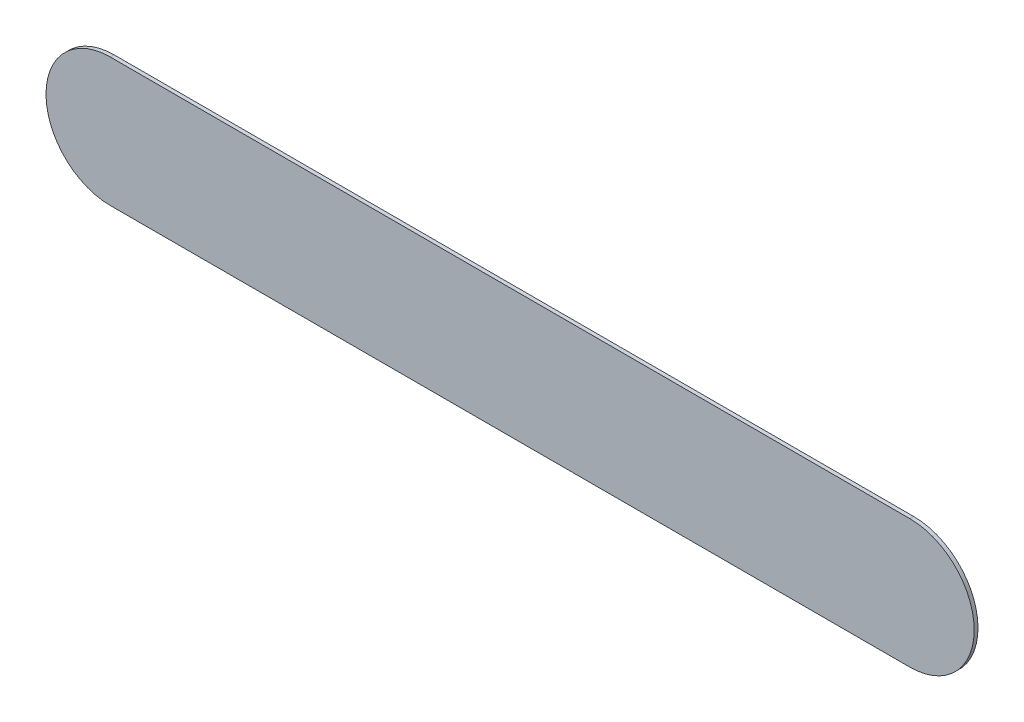
ISO-10303-21;
HEADER;
FILE_DESCRIPTION(('STEP AP214'),'2;1');
FILE_NAME('part.step','',(''),(''),'','','');
FILE_SCHEMA(('AUTOMOTIVE_DESIGN { 1 0 10303 214 1 1 1 1 }'));
ENDSEC;
DATA;
#1=APPLICATION_CONTEXT('core data for automotive mechanical design processes');
#2=APPLICATION_PROTOCOL_DEFINITION('international standard','automotive_design',2000,#1);
#3=PRODUCT_CONTEXT('',#1,'mechanical');
#4=PRODUCT('Part','Part','',(#3));
#5=PRODUCT_RELATED_PRODUCT_CATEGORY('part','',(#4));
#6=PRODUCT_DEFINITION_FORMATION('','',#4);
#7=PRODUCT_DEFINITION_CONTEXT('part definition',#1,'design');
#8=PRODUCT_DEFINITION('design','',#6,#7);
#9=PRODUCT_DEFINITION_SHAPE('','',#8);
#10=(LENGTH_UNIT() NAMED_UNIT(*) SI_UNIT(.MILLI.,.METRE.));
#11=(NAMED_UNIT(*) PLANE_ANGLE_UNIT() SI_UNIT($,.RADIAN.));
#12=(NAMED_UNIT(*) SI_UNIT($,.STERADIAN.) SOLID_ANGLE_UNIT());
#13=UNCERTAINTY_MEASURE_WITH_UNIT(LENGTH_MEASURE(1.E-05),#10,'distance_accuracy_value','');
#14=(GEOMETRIC_REPRESENTATION_CONTEXT(3) GLOBAL_UNCERTAINTY_ASSIGNED_CONTEXT((#13)) GLOBAL_UNIT_ASSIGNED_CONTEXT((#10,
#11,#12)) REPRESENTATION_CONTEXT('',''));
#15=CARTESIAN_POINT('',(0.,0.,0.));
#16=DIRECTION('',(0.,0.,1.));
#17=DIRECTION('',(1.,0.,0.));
#18=AXIS2_PLACEMENT_3D('',#15,#16,#17);
#19=CARTESIAN_POINT('',(43.39999956,50.4000008,0.));
#20=DIRECTION('',(0.,1.,0.));
#21=DIRECTION('',(1.,0.,0.));
#22=AXIS2_PLACEMENT_3D('',#19,#20,#21);
#23=PLANE('',#22);
#24=DIRECTION('',(1.,0.,0.));
#25=VECTOR('',#24,1.);
#26=CARTESIAN_POINT('',(43.39999956,50.4000008,0.03556));
#27=LINE('',#26,#25);
#28=CARTESIAN_POINT('',(43.39999956,50.4000008,0.03556));
#29=VERTEX_POINT('',#28);
#30=CARTESIAN_POINT('',(50.86000496,50.4000008,0.03556));
#31=VERTEX_POINT('',#30);
#32=EDGE_CURVE('E11',#29,#31,#27,.T.);
#33=ORIENTED_EDGE('',*,*,#32,.F.);
#34=DIRECTION('',(0.,0.,1.));
#35=VECTOR('',#34,1.);
#36=CARTESIAN_POINT('',(43.39999956,50.4000008,0.));
#37=LINE('',#36,#35);
#38=CARTESIAN_POINT('',(43.39999956,50.4000008,0.));
#39=VERTEX_POINT('',#38);
#40=EDGE_CURVE('E24',#39,#29,#37,.T.);
#41=ORIENTED_EDGE('',*,*,#40,.F.);
#42=DIRECTION('',(1.,0.,0.));
#43=VECTOR('',#42,1.);
#44=CARTESIAN_POINT('',(43.39999956,50.4000008,0.));
#45=LINE('',#44,#43);
#46=CARTESIAN_POINT('',(50.86000496,50.4000008,0.));
#47=VERTEX_POINT('',#46);
#48=EDGE_CURVE('E75',#39,#47,#45,.T.);
#49=ORIENTED_EDGE('',*,*,#48,.T.);
#50=DIRECTION('',(0.,0.,1.));
#51=VECTOR('',#50,1.);
#52=CARTESIAN_POINT('',(50.86000496,50.4000008,0.));
#53=LINE('',#52,#51);
#54=EDGE_CURVE('E37',#47,#31,#53,.T.);
#55=ORIENTED_EDGE('',*,*,#54,.T.);
#56=EDGE_LOOP('',(#33,#41,#49,#55));
#57=FACE_BOUND('',#56,.T.);
#58=ADVANCED_FACE('F17',(#57),#23,.F.);
#59=CARTESIAN_POINT('',(50.86000496,50.9999996,0.));
#60=DIRECTION('',(0.,0.,-1.));
#61=DIRECTION('',(0.,-1.,0.));
#62=AXIS2_PLACEMENT_3D('',#59,#60,#61);
#63=CYLINDRICAL_SURFACE('',#62,0.599998800000002);
#64=CARTESIAN_POINT('',(50.86000496,50.9999996,0.03556));
#65=DIRECTION('',(0.,0.,1.));
#66=DIRECTION('',(0.,-1.,0.));
#67=AXIS2_PLACEMENT_3D('',#64,#65,#66);
#68=CIRCLE('',#67,0.599998800000002);
#69=CARTESIAN_POINT('',(50.86000496,51.5999984,0.03556));
#70=VERTEX_POINT('',#69);
#71=EDGE_CURVE('E83',#31,#70,#68,.T.);
#72=ORIENTED_EDGE('',*,*,#71,.F.);
#73=ORIENTED_EDGE('',*,*,#54,.F.);
#74=CARTESIAN_POINT('',(50.86000496,50.9999996,0.));
#75=DIRECTION('',(0.,0.,1.));
#76=DIRECTION('',(0.,-1.,0.));
#77=AXIS2_PLACEMENT_3D('',#74,#75,#76);
#78=CIRCLE('',#77,0.599998800000002);
#79=CARTESIAN_POINT('',(50.86000496,51.5999984,0.));
#80=VERTEX_POINT('',#79);
#81=EDGE_CURVE('E81',#47,#80,#78,.T.);
#82=ORIENTED_EDGE('',*,*,#81,.T.);
#83=DIRECTION('',(0.,0.,1.));
#84=VECTOR('',#83,1.);
#85=CARTESIAN_POINT('',(50.86000496,51.5999984,0.));
#86=LINE('',#85,#84);
#87=EDGE_CURVE('E67',#80,#70,#86,.T.);
#88=ORIENTED_EDGE('',*,*,#87,.T.);
#89=EDGE_LOOP('',(#72,#73,#82,#88));
#90=FACE_BOUND('',#89,.T.);
#91=ADVANCED_FACE('F89',(#90),#63,.T.);
#92=CARTESIAN_POINT('',(50.86000496,51.5999984,0.));
#93=DIRECTION('',(0.,-1.,0.));
#94=DIRECTION('',(-1.,0.,0.));
#95=AXIS2_PLACEMENT_3D('',#92,#93,#94);
#96=PLANE('',#95);
#97=DIRECTION('',(-1.,0.,0.));
#98=VECTOR('',#97,1.);
#99=CARTESIAN_POINT('',(50.86000496,51.5999984,0.03556));
#100=LINE('',#99,#98);
#101=CARTESIAN_POINT('',(43.39999956,51.5999984,0.03556));
#102=VERTEX_POINT('',#101);
#103=EDGE_CURVE('E71',#70,#102,#100,.T.);
#104=ORIENTED_EDGE('',*,*,#103,.F.);
#105=ORIENTED_EDGE('',*,*,#87,.F.);
#106=DIRECTION('',(-1.,0.,0.));
#107=VECTOR('',#106,1.);
#108=CARTESIAN_POINT('',(50.86000496,51.5999984,0.));
#109=LINE('',#108,#107);
#110=CARTESIAN_POINT('',(43.39999956,51.5999984,0.));
#111=VERTEX_POINT('',#110);
#112=EDGE_CURVE('E63',#80,#111,#109,.T.);
#113=ORIENTED_EDGE('',*,*,#112,.T.);
#114=DIRECTION('',(0.,0.,1.));
#115=VECTOR('',#114,1.);
#116=CARTESIAN_POINT('',(43.39999956,51.5999984,0.));
#117=LINE('',#116,#115);
#118=EDGE_CURVE('E53',#111,#102,#117,.T.);
#119=ORIENTED_EDGE('',*,*,#118,.T.);
#120=EDGE_LOOP('',(#104,#105,#113,#119));
#121=FACE_BOUND('',#120,.T.);
#122=ADVANCED_FACE('F66',(#121),#96,.F.);
#123=CARTESIAN_POINT('',(43.39999956,50.9999996,0.));
#124=DIRECTION('',(0.,0.,-1.));
#125=DIRECTION('',(0.,1.,0.));
#126=AXIS2_PLACEMENT_3D('',#123,#124,#125);
#127=CYLINDRICAL_SURFACE('',#126,0.599998800000002);
#128=CARTESIAN_POINT('',(43.39999956,50.9999996,0.03556));
#129=DIRECTION('',(0.,0.,1.));
#130=DIRECTION('',(0.,1.,0.));
#131=AXIS2_PLACEMENT_3D('',#128,#129,#130);
#132=CIRCLE('',#131,0.599998800000002);
#133=EDGE_CURVE('E59',#102,#29,#132,.T.);
#134=ORIENTED_EDGE('',*,*,#133,.F.);
#135=ORIENTED_EDGE('',*,*,#118,.F.);
#136=CARTESIAN_POINT('',(43.39999956,50.9999996,0.));
#137=DIRECTION('',(0.,0.,1.));
#138=DIRECTION('',(0.,1.,0.));
#139=AXIS2_PLACEMENT_3D('',#136,#137,#138);
#140=CIRCLE('',#139,0.599998800000002);
#141=EDGE_CURVE('E57',#111,#39,#140,.T.);
#142=ORIENTED_EDGE('',*,*,#141,.T.);
#143=ORIENTED_EDGE('',*,*,#40,.T.);
#144=EDGE_LOOP('',(#134,#135,#142,#143));
#145=FACE_BOUND('',#144,.T.);
#146=ADVANCED_FACE('F55',(#145),#127,.T.);
#147=CARTESIAN_POINT('',(43.39999956,50.4000008,0.));
#148=DIRECTION('',(0.,0.,-1.));
#149=DIRECTION('',(-1.,0.,0.));
#150=AXIS2_PLACEMENT_3D('',#147,#148,#149);
#151=PLANE('',#150);
#152=ORIENTED_EDGE('',*,*,#141,.F.);
#153=ORIENTED_EDGE('',*,*,#112,.F.);
#154=ORIENTED_EDGE('',*,*,#81,.F.);
#155=ORIENTED_EDGE('',*,*,#48,.F.);
#156=EDGE_LOOP('',(#152,#153,#154,#155));
#157=FACE_BOUND('',#156,.T.);
#158=ADVANCED_FACE('F74',(#157),#151,.T.);
#159=CARTESIAN_POINT('',(43.39999956,50.4000008,0.03556));
#160=DIRECTION('',(0.,0.,-1.));
#161=DIRECTION('',(-1.,0.,0.));
#162=AXIS2_PLACEMENT_3D('',#159,#160,#161);
#163=PLANE('',#162);
#164=ORIENTED_EDGE('',*,*,#32,.T.);
#165=ORIENTED_EDGE('',*,*,#71,.T.);
#166=ORIENTED_EDGE('',*,*,#103,.T.);
#167=ORIENTED_EDGE('',*,*,#133,.T.);
#168=EDGE_LOOP('',(#164,#165,#166,#167));
#169=FACE_BOUND('',#168,.T.);
#170=ADVANCED_FACE('F91',(#169),#163,.F.);
#171=CLOSED_SHELL('',(#58,#91,#122,#146,#158,#170));
#172=MANIFOLD_SOLID_BREP('B1',#171);
#173=ADVANCED_BREP_SHAPE_REPRESENTATION('',(#18,#172),#14);
#174=SHAPE_DEFINITION_REPRESENTATION(#9,#173);
ENDSEC;
END-ISO-10303-21;
